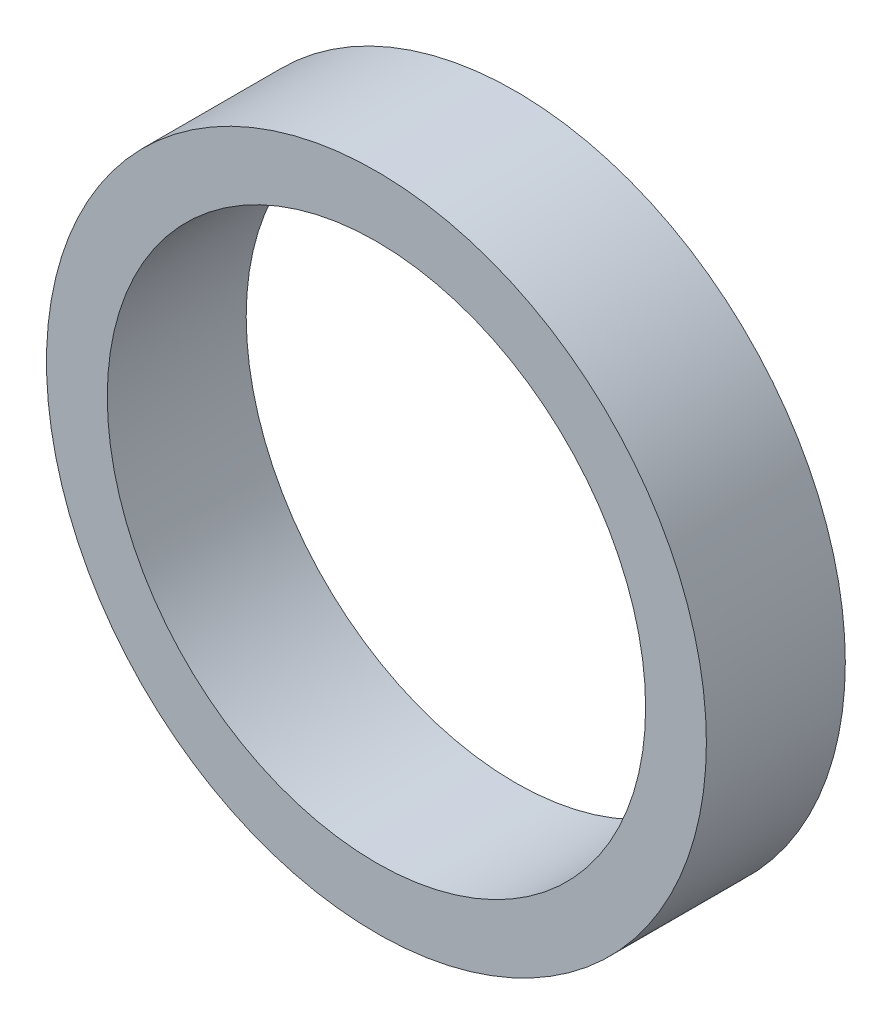
ISO-10303-21;
HEADER;
FILE_DESCRIPTION(('STEP AP214'),'2;1');
FILE_NAME('part.step','',(''),(''),'','','');
FILE_SCHEMA(('AUTOMOTIVE_DESIGN { 1 0 10303 214 1 1 1 1 }'));
ENDSEC;
DATA;
#1=APPLICATION_CONTEXT('core data for automotive mechanical design processes');
#2=APPLICATION_PROTOCOL_DEFINITION('international standard','automotive_design',2000,#1);
#3=PRODUCT_CONTEXT('',#1,'mechanical');
#4=PRODUCT('Part','Part','',(#3));
#5=PRODUCT_RELATED_PRODUCT_CATEGORY('part','',(#4));
#6=PRODUCT_DEFINITION_FORMATION('','',#4);
#7=PRODUCT_DEFINITION_CONTEXT('part definition',#1,'design');
#8=PRODUCT_DEFINITION('design','',#6,#7);
#9=PRODUCT_DEFINITION_SHAPE('','',#8);
#10=(LENGTH_UNIT() NAMED_UNIT(*) SI_UNIT(.MILLI.,.METRE.));
#11=(NAMED_UNIT(*) PLANE_ANGLE_UNIT() SI_UNIT($,.RADIAN.));
#12=(NAMED_UNIT(*) SI_UNIT($,.STERADIAN.) SOLID_ANGLE_UNIT());
#13=UNCERTAINTY_MEASURE_WITH_UNIT(LENGTH_MEASURE(1.E-05),#10,'distance_accuracy_value','');
#14=(GEOMETRIC_REPRESENTATION_CONTEXT(3) GLOBAL_UNCERTAINTY_ASSIGNED_CONTEXT((#13)) GLOBAL_UNIT_ASSIGNED_CONTEXT((#10,
#11,#12)) REPRESENTATION_CONTEXT('',''));
#15=CARTESIAN_POINT('',(0.,0.,0.));
#16=DIRECTION('',(0.,0.,1.));
#17=DIRECTION('',(1.,0.,0.));
#18=AXIS2_PLACEMENT_3D('',#15,#16,#17);
#19=CARTESIAN_POINT('',(0.,0.,8.));
#20=DIRECTION('',(0.,0.,1.));
#21=DIRECTION('',(1.,0.,0.));
#22=AXIS2_PLACEMENT_3D('',#19,#20,#21);
#23=PLANE('',#22);
#24=CARTESIAN_POINT('',(0.,0.,8.));
#25=DIRECTION('',(0.,0.,1.));
#26=DIRECTION('',(1.,0.,0.));
#27=AXIS2_PLACEMENT_3D('',#24,#25,#26);
#28=CIRCLE('',#27,19.);
#29=CARTESIAN_POINT('',(19.,0.,8.));
#30=VERTEX_POINT('',#29);
#31=EDGE_CURVE('E10',#30,#30,#28,.T.);
#32=ORIENTED_EDGE('',*,*,#31,.T.);
#33=EDGE_LOOP('',(#32));
#34=FACE_BOUND('',#33,.T.);
#35=CARTESIAN_POINT('',(0.,0.,8.));
#36=DIRECTION('',(0.,0.,1.));
#37=DIRECTION('',(1.,0.,0.));
#38=AXIS2_PLACEMENT_3D('',#35,#36,#37);
#39=CIRCLE('',#38,15.5);
#40=CARTESIAN_POINT('',(15.5,0.,8.));
#41=VERTEX_POINT('',#40);
#42=EDGE_CURVE('E41',#41,#41,#39,.T.);
#43=ORIENTED_EDGE('',*,*,#42,.F.);
#44=EDGE_LOOP('',(#43));
#45=FACE_BOUND('',#44,.T.);
#46=ADVANCED_FACE('F30',(#34,#45),#23,.T.);
#47=CARTESIAN_POINT('',(0.,0.,0.));
#48=DIRECTION('',(0.,0.,1.));
#49=DIRECTION('',(1.,0.,0.));
#50=AXIS2_PLACEMENT_3D('',#47,#48,#49);
#51=PLANE('',#50);
#52=CARTESIAN_POINT('',(0.,0.,0.));
#53=DIRECTION('',(0.,0.,1.));
#54=DIRECTION('',(1.,0.,0.));
#55=AXIS2_PLACEMENT_3D('',#52,#53,#54);
#56=CIRCLE('',#55,19.);
#57=CARTESIAN_POINT('',(19.,0.,0.));
#58=VERTEX_POINT('',#57);
#59=EDGE_CURVE('E34',#58,#58,#56,.T.);
#60=ORIENTED_EDGE('',*,*,#59,.F.);
#61=EDGE_LOOP('',(#60));
#62=FACE_BOUND('',#61,.T.);
#63=CARTESIAN_POINT('',(0.,0.,0.));
#64=DIRECTION('',(0.,0.,1.));
#65=DIRECTION('',(1.,0.,0.));
#66=AXIS2_PLACEMENT_3D('',#63,#64,#65);
#67=CIRCLE('',#66,15.5);
#68=CARTESIAN_POINT('',(15.5,0.,0.));
#69=VERTEX_POINT('',#68);
#70=EDGE_CURVE('E43',#69,#69,#67,.T.);
#71=ORIENTED_EDGE('',*,*,#70,.T.);
#72=EDGE_LOOP('',(#71));
#73=FACE_BOUND('',#72,.T.);
#74=ADVANCED_FACE('F53',(#62,#73),#51,.F.);
#75=CARTESIAN_POINT('',(0.,0.,8.));
#76=DIRECTION('',(0.,0.,-1.));
#77=DIRECTION('',(-1.,0.,0.));
#78=AXIS2_PLACEMENT_3D('',#75,#76,#77);
#79=CYLINDRICAL_SURFACE('',#78,19.);
#80=ORIENTED_EDGE('',*,*,#31,.F.);
#81=EDGE_LOOP('',(#80));
#82=FACE_BOUND('',#81,.T.);
#83=ORIENTED_EDGE('',*,*,#59,.T.);
#84=EDGE_LOOP('',(#83));
#85=FACE_BOUND('',#84,.T.);
#86=ADVANCED_FACE('F32',(#82,#85),#79,.T.);
#87=CARTESIAN_POINT('',(0.,0.,8.));
#88=DIRECTION('',(0.,0.,-1.));
#89=DIRECTION('',(-1.,0.,0.));
#90=AXIS2_PLACEMENT_3D('',#87,#88,#89);
#91=CYLINDRICAL_SURFACE('',#90,15.5);
#92=ORIENTED_EDGE('',*,*,#42,.T.);
#93=EDGE_LOOP('',(#92));
#94=FACE_BOUND('',#93,.T.);
#95=ORIENTED_EDGE('',*,*,#70,.F.);
#96=EDGE_LOOP('',(#95));
#97=FACE_BOUND('',#96,.T.);
#98=ADVANCED_FACE('F49',(#94,#97),#91,.F.);
#99=CLOSED_SHELL('',(#46,#74,#86,#98));
#100=MANIFOLD_SOLID_BREP('B2',#99);
#101=ADVANCED_BREP_SHAPE_REPRESENTATION('',(#18,#100),#14);
#102=SHAPE_DEFINITION_REPRESENTATION(#9,#101);
ENDSEC;
END-ISO-10303-21;
